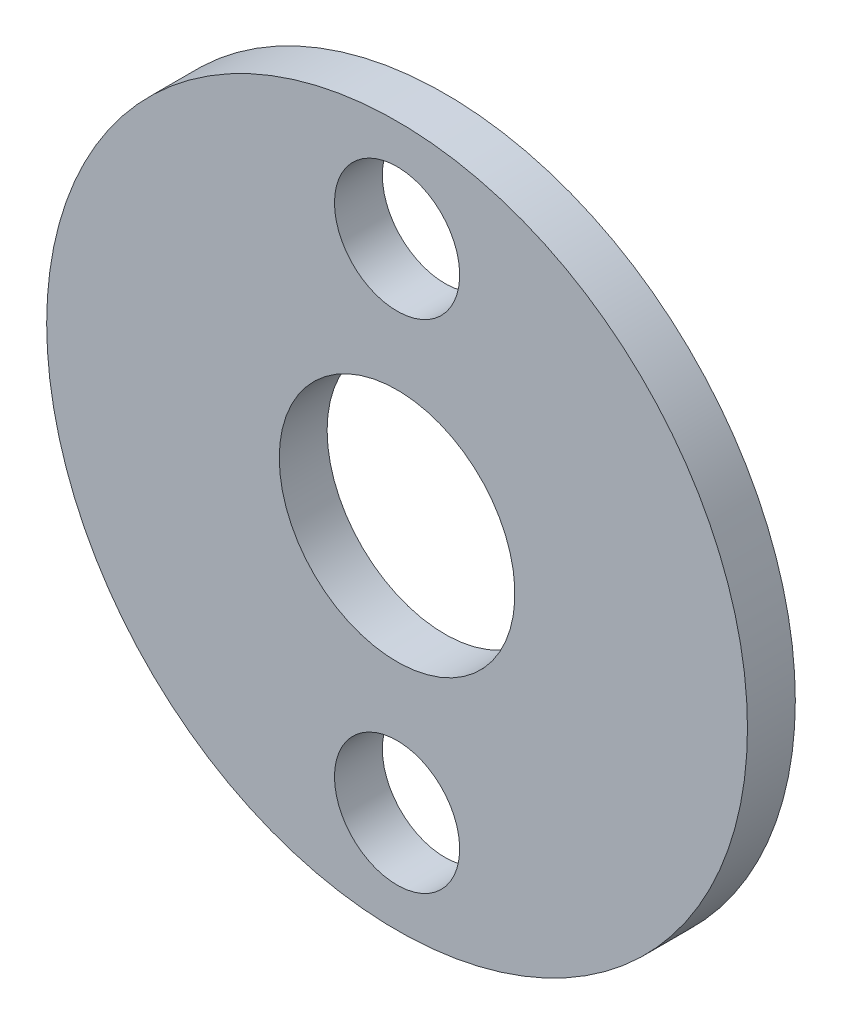
ISO-10303-21;
HEADER;
FILE_DESCRIPTION(('STEP AP214'),'2;1');
FILE_NAME('part.step','',(''),(''),'','','');
FILE_SCHEMA(('AUTOMOTIVE_DESIGN { 1 0 10303 214 1 1 1 1 }'));
ENDSEC;
DATA;
#1=APPLICATION_CONTEXT('core data for automotive mechanical design processes');
#2=APPLICATION_PROTOCOL_DEFINITION('international standard','automotive_design',2000,#1);
#3=PRODUCT_CONTEXT('',#1,'mechanical');
#4=PRODUCT('Part','Part','',(#3));
#5=PRODUCT_RELATED_PRODUCT_CATEGORY('part','',(#4));
#6=PRODUCT_DEFINITION_FORMATION('','',#4);
#7=PRODUCT_DEFINITION_CONTEXT('part definition',#1,'design');
#8=PRODUCT_DEFINITION('design','',#6,#7);
#9=PRODUCT_DEFINITION_SHAPE('','',#8);
#10=(LENGTH_UNIT() NAMED_UNIT(*) SI_UNIT(.MILLI.,.METRE.));
#11=(NAMED_UNIT(*) PLANE_ANGLE_UNIT() SI_UNIT($,.RADIAN.));
#12=(NAMED_UNIT(*) SI_UNIT($,.STERADIAN.) SOLID_ANGLE_UNIT());
#13=UNCERTAINTY_MEASURE_WITH_UNIT(LENGTH_MEASURE(1.E-05),#10,'distance_accuracy_value','');
#14=(GEOMETRIC_REPRESENTATION_CONTEXT(3) GLOBAL_UNCERTAINTY_ASSIGNED_CONTEXT((#13)) GLOBAL_UNIT_ASSIGNED_CONTEXT((#10,
#11,#12)) REPRESENTATION_CONTEXT('',''));
#15=CARTESIAN_POINT('',(0.,0.,0.));
#16=DIRECTION('',(0.,0.,1.));
#17=DIRECTION('',(1.,0.,0.));
#18=AXIS2_PLACEMENT_3D('',#15,#16,#17);
#19=CARTESIAN_POINT('',(0.,0.,1.651));
#20=DIRECTION('',(0.,0.,1.));
#21=DIRECTION('',(1.,0.,0.));
#22=AXIS2_PLACEMENT_3D('',#19,#20,#21);
#23=PLANE('',#22);
#24=CARTESIAN_POINT('',(0.,8.57250000000001,1.651));
#25=DIRECTION('',(0.,0.,1.));
#26=DIRECTION('',(1.,0.,0.));
#27=AXIS2_PLACEMENT_3D('',#24,#25,#26);
#28=CIRCLE('',#27,2.159);
#29=CARTESIAN_POINT('',(-2.159,8.57250000000001,1.651));
#30=VERTEX_POINT('',#29);
#31=EDGE_CURVE('E47',#30,#30,#28,.T.);
#32=ORIENTED_EDGE('',*,*,#31,.F.);
#33=EDGE_LOOP('',(#32));
#34=FACE_BOUND('',#33,.T.);
#35=CARTESIAN_POINT('',(0.,0.,1.651));
#36=DIRECTION('',(0.,0.,1.));
#37=DIRECTION('',(1.,0.,0.));
#38=AXIS2_PLACEMENT_3D('',#35,#36,#37);
#39=CIRCLE('',#38,12.0871729386303);
#40=CARTESIAN_POINT('',(-12.0871729386303,0.,1.651));
#41=VERTEX_POINT('',#40);
#42=EDGE_CURVE('E10',#41,#41,#39,.T.);
#43=ORIENTED_EDGE('',*,*,#42,.T.);
#44=EDGE_LOOP('',(#43));
#45=FACE_BOUND('',#44,.T.);
#46=CARTESIAN_POINT('',(0.,0.,1.651));
#47=DIRECTION('',(0.,0.,1.));
#48=DIRECTION('',(1.,0.,0.));
#49=AXIS2_PLACEMENT_3D('',#46,#47,#48);
#50=CIRCLE('',#49,4.064);
#51=CARTESIAN_POINT('',(-4.064,0.,1.651));
#52=VERTEX_POINT('',#51);
#53=EDGE_CURVE('E42',#52,#52,#50,.T.);
#54=ORIENTED_EDGE('',*,*,#53,.F.);
#55=EDGE_LOOP('',(#54));
#56=FACE_BOUND('',#55,.T.);
#57=CARTESIAN_POINT('',(0.,-8.57250000000001,1.651));
#58=DIRECTION('',(0.,0.,1.));
#59=DIRECTION('',(1.,0.,0.));
#60=AXIS2_PLACEMENT_3D('',#57,#58,#59);
#61=CIRCLE('',#60,2.159);
#62=CARTESIAN_POINT('',(-2.159,-8.57250000000001,1.651));
#63=VERTEX_POINT('',#62);
#64=EDGE_CURVE('E53',#63,#63,#61,.T.);
#65=ORIENTED_EDGE('',*,*,#64,.F.);
#66=EDGE_LOOP('',(#65));
#67=FACE_BOUND('',#66,.T.);
#68=ADVANCED_FACE('F31',(#34,#45,#56,#67),#23,.T.);
#69=CARTESIAN_POINT('',(0.,0.,0.));
#70=DIRECTION('',(0.,0.,1.));
#71=DIRECTION('',(1.,0.,0.));
#72=AXIS2_PLACEMENT_3D('',#69,#70,#71);
#73=PLANE('',#72);
#74=CARTESIAN_POINT('',(0.,0.,0.));
#75=DIRECTION('',(0.,0.,1.));
#76=DIRECTION('',(1.,0.,0.));
#77=AXIS2_PLACEMENT_3D('',#74,#75,#76);
#78=CIRCLE('',#77,12.0871729386303);
#79=CARTESIAN_POINT('',(-12.0871729386303,0.,0.));
#80=VERTEX_POINT('',#79);
#81=EDGE_CURVE('E35',#80,#80,#78,.T.);
#82=ORIENTED_EDGE('',*,*,#81,.F.);
#83=EDGE_LOOP('',(#82));
#84=FACE_BOUND('',#83,.T.);
#85=CARTESIAN_POINT('',(0.,0.,0.));
#86=DIRECTION('',(0.,0.,1.));
#87=DIRECTION('',(1.,0.,0.));
#88=AXIS2_PLACEMENT_3D('',#85,#86,#87);
#89=CIRCLE('',#88,4.064);
#90=CARTESIAN_POINT('',(-4.064,0.,0.));
#91=VERTEX_POINT('',#90);
#92=EDGE_CURVE('E44',#91,#91,#89,.T.);
#93=ORIENTED_EDGE('',*,*,#92,.T.);
#94=EDGE_LOOP('',(#93));
#95=FACE_BOUND('',#94,.T.);
#96=CARTESIAN_POINT('',(0.,8.57250000000001,0.));
#97=DIRECTION('',(0.,0.,1.));
#98=DIRECTION('',(1.,0.,0.));
#99=AXIS2_PLACEMENT_3D('',#96,#97,#98);
#100=CIRCLE('',#99,2.159);
#101=CARTESIAN_POINT('',(-2.159,8.57250000000001,0.));
#102=VERTEX_POINT('',#101);
#103=EDGE_CURVE('E50',#102,#102,#100,.T.);
#104=ORIENTED_EDGE('',*,*,#103,.T.);
#105=EDGE_LOOP('',(#104));
#106=FACE_BOUND('',#105,.T.);
#107=CARTESIAN_POINT('',(0.,-8.57250000000001,0.));
#108=DIRECTION('',(0.,0.,1.));
#109=DIRECTION('',(1.,0.,0.));
#110=AXIS2_PLACEMENT_3D('',#107,#108,#109);
#111=CIRCLE('',#110,2.159);
#112=CARTESIAN_POINT('',(-2.159,-8.57250000000001,0.));
#113=VERTEX_POINT('',#112);
#114=EDGE_CURVE('E56',#113,#113,#111,.T.);
#115=ORIENTED_EDGE('',*,*,#114,.T.);
#116=EDGE_LOOP('',(#115));
#117=FACE_BOUND('',#116,.T.);
#118=ADVANCED_FACE('F66',(#84,#95,#106,#117),#73,.F.);
#119=CARTESIAN_POINT('',(0.,0.,1.651));
#120=DIRECTION('',(0.,0.,-1.));
#121=DIRECTION('',(-1.,0.,0.));
#122=AXIS2_PLACEMENT_3D('',#119,#120,#121);
#123=CYLINDRICAL_SURFACE('',#122,12.0871729386303);
#124=CARTESIAN_POINT('',(-12.0871729386303,0.,1.651));
#125=CARTESIAN_POINT('',(-12.0871729386303,0.,1.63380208333333));
#126=CARTESIAN_POINT('',(-12.0871729386303,0.,1.61660416666667));
#127=CARTESIAN_POINT('',(-12.0871729386303,0.,1.58220833333333));
#128=CARTESIAN_POINT('',(-12.0871729386303,0.,1.56501041666667));
#129=CARTESIAN_POINT('',(-12.0871729386303,0.,1.53061458333333));
#130=CARTESIAN_POINT('',(-12.0871729386303,0.,1.51341666666667));
#131=CARTESIAN_POINT('',(-12.0871729386303,0.,1.47902083333333));
#132=CARTESIAN_POINT('',(-12.0871729386303,0.,1.46182291666667));
#133=CARTESIAN_POINT('',(-12.0871729386303,0.,1.42742708333333));
#134=CARTESIAN_POINT('',(-12.0871729386303,0.,1.41022916666667));
#135=CARTESIAN_POINT('',(-12.0871729386303,0.,1.37583333333333));
#136=CARTESIAN_POINT('',(-12.0871729386303,0.,1.35863541666667));
#137=CARTESIAN_POINT('',(-12.0871729386303,0.,1.32423958333333));
#138=CARTESIAN_POINT('',(-12.0871729386303,0.,1.30704166666667));
#139=CARTESIAN_POINT('',(-12.0871729386303,0.,1.27264583333333));
#140=CARTESIAN_POINT('',(-12.0871729386303,0.,1.25544791666667));
#141=CARTESIAN_POINT('',(-12.0871729386303,0.,1.22105208333333));
#142=CARTESIAN_POINT('',(-12.0871729386303,0.,1.20385416666667));
#143=CARTESIAN_POINT('',(-12.0871729386303,0.,1.16945833333333));
#144=CARTESIAN_POINT('',(-12.0871729386303,0.,1.15226041666667));
#145=CARTESIAN_POINT('',(-12.0871729386303,0.,1.11786458333333));
#146=CARTESIAN_POINT('',(-12.0871729386303,0.,1.10066666666667));
#147=CARTESIAN_POINT('',(-12.0871729386303,0.,1.06627083333333));
#148=CARTESIAN_POINT('',(-12.0871729386303,0.,1.04907291666667));
#149=CARTESIAN_POINT('',(-12.0871729386303,0.,1.01467708333333));
#150=CARTESIAN_POINT('',(-12.0871729386303,0.,0.997479166666666));
#151=CARTESIAN_POINT('',(-12.0871729386303,0.,0.963083333333333));
#152=CARTESIAN_POINT('',(-12.0871729386303,0.,0.945885416666667));
#153=CARTESIAN_POINT('',(-12.0871729386303,0.,0.911489583333333));
#154=CARTESIAN_POINT('',(-12.0871729386303,0.,0.894291666666667));
#155=CARTESIAN_POINT('',(-12.0871729386303,0.,0.859895833333333));
#156=CARTESIAN_POINT('',(-12.0871729386303,0.,0.842697916666667));
#157=CARTESIAN_POINT('',(-12.0871729386303,0.,0.808302083333333));
#158=CARTESIAN_POINT('',(-12.0871729386303,0.,0.791104166666667));
#159=CARTESIAN_POINT('',(-12.0871729386303,0.,0.756708333333333));
#160=CARTESIAN_POINT('',(-12.0871729386303,0.,0.739510416666667));
#161=CARTESIAN_POINT('',(-12.0871729386303,0.,0.705114583333333));
#162=CARTESIAN_POINT('',(-12.0871729386303,0.,0.687916666666667));
#163=CARTESIAN_POINT('',(-12.0871729386303,0.,0.653520833333333));
#164=CARTESIAN_POINT('',(-12.0871729386303,0.,0.636322916666667));
#165=CARTESIAN_POINT('',(-12.0871729386303,0.,0.601927083333333));
#166=CARTESIAN_POINT('',(-12.0871729386303,0.,0.584729166666667));
#167=CARTESIAN_POINT('',(-12.0871729386303,0.,0.550333333333333));
#168=CARTESIAN_POINT('',(-12.0871729386303,0.,0.533135416666667));
#169=CARTESIAN_POINT('',(-12.0871729386303,0.,0.498739583333333));
#170=CARTESIAN_POINT('',(-12.0871729386303,0.,0.481541666666667));
#171=CARTESIAN_POINT('',(-12.0871729386303,0.,0.447145833333333));
#172=CARTESIAN_POINT('',(-12.0871729386303,0.,0.429947916666667));
#173=CARTESIAN_POINT('',(-12.0871729386303,0.,0.395552083333333));
#174=CARTESIAN_POINT('',(-12.0871729386303,0.,0.378354166666667));
#175=CARTESIAN_POINT('',(-12.0871729386303,0.,0.343958333333333));
#176=CARTESIAN_POINT('',(-12.0871729386303,0.,0.326760416666667));
#177=CARTESIAN_POINT('',(-12.0871729386303,0.,0.292364583333333));
#178=CARTESIAN_POINT('',(-12.0871729386303,0.,0.275166666666667));
#179=CARTESIAN_POINT('',(-12.0871729386303,0.,0.240770833333333));
#180=CARTESIAN_POINT('',(-12.0871729386303,0.,0.223572916666667));
#181=CARTESIAN_POINT('',(-12.0871729386303,0.,0.189177083333333));
#182=CARTESIAN_POINT('',(-12.0871729386303,0.,0.171979166666667));
#183=CARTESIAN_POINT('',(-12.0871729386303,0.,0.137583333333333));
#184=CARTESIAN_POINT('',(-12.0871729386303,0.,0.120385416666667));
#185=CARTESIAN_POINT('',(-12.0871729386303,0.,0.0859895833333333));
#186=CARTESIAN_POINT('',(-12.0871729386303,0.,0.0687916666666667));
#187=CARTESIAN_POINT('',(-12.0871729386303,0.,0.0343958333333333));
#188=CARTESIAN_POINT('',(-12.0871729386303,0.,0.0171979166666666));
#189=CARTESIAN_POINT('',(-12.0871729386303,0.,0.));
#190=B_SPLINE_CURVE_WITH_KNOTS('',3,(#124,#125,#126,#127,#128,#129,#130,#131,#132,#133,#134,
#135,#136,#137,#138,#139,#140,#141,#142,#143,#144,#145,#146,#147,#148,#149,#150,#151,#152,#153,
#154,#155,#156,#157,#158,#159,#160,#161,#162,#163,#164,#165,#166,#167,#168,#169,#170,#171,#172,
#173,#174,#175,#176,#177,#178,#179,#180,#181,#182,#183,#184,#185,#186,#187,#188,#189),
.UNSPECIFIED.,.F.,.F.,(4,2,2,2,2,2,2,2,2,2,2,2,2,2,2,2,2,2,2,2,2,2,2,2,2,2,2,2,2,2,2,2,4),(0.,
0.05159375,0.1031875,0.15478125,0.206375,0.25796875,0.3095625,0.36115625,0.41275,0.46434375,
0.5159375,0.56753125,0.619125,0.67071875,0.7223125,0.77390625,0.8255,0.87709375,0.9286875,
0.98028125,1.031875,1.08346875,1.1350625,1.18665625,1.23825,1.28984375,1.3414375,1.39303125,
1.444625,1.49621875,1.5478125,1.59940625,1.651),.UNSPECIFIED.);
#191=EDGE_CURVE('BSEAM33',#41,#80,#190,.T.);
#192=ORIENTED_EDGE('',*,*,#42,.F.);
#193=ORIENTED_EDGE('',*,*,#81,.T.);
#194=ORIENTED_EDGE('',*,*,#191,.T.);
#195=ORIENTED_EDGE('',*,*,#191,.F.);
#196=EDGE_LOOP('',(#192,#194,#193,#195));
#197=FACE_BOUND('',#196,.T.);
#198=ADVANCED_FACE('F33',(#197),#123,.T.);
#199=CARTESIAN_POINT('',(0.,0.,1.651));
#200=DIRECTION('',(0.,0.,-1.));
#201=DIRECTION('',(-1.,0.,0.));
#202=AXIS2_PLACEMENT_3D('',#199,#200,#201);
#203=CYLINDRICAL_SURFACE('',#202,4.064);
#204=CARTESIAN_POINT('',(-4.064,0.,1.651));
#205=CARTESIAN_POINT('',(-4.064,0.,1.63380208333333));
#206=CARTESIAN_POINT('',(-4.064,0.,1.61660416666667));
#207=CARTESIAN_POINT('',(-4.064,0.,1.58220833333333));
#208=CARTESIAN_POINT('',(-4.064,0.,1.56501041666667));
#209=CARTESIAN_POINT('',(-4.064,0.,1.53061458333333));
#210=CARTESIAN_POINT('',(-4.064,0.,1.51341666666667));
#211=CARTESIAN_POINT('',(-4.064,0.,1.47902083333333));
#212=CARTESIAN_POINT('',(-4.064,0.,1.46182291666667));
#213=CARTESIAN_POINT('',(-4.064,0.,1.42742708333333));
#214=CARTESIAN_POINT('',(-4.064,0.,1.41022916666667));
#215=CARTESIAN_POINT('',(-4.064,0.,1.37583333333333));
#216=CARTESIAN_POINT('',(-4.064,0.,1.35863541666667));
#217=CARTESIAN_POINT('',(-4.064,0.,1.32423958333333));
#218=CARTESIAN_POINT('',(-4.064,0.,1.30704166666667));
#219=CARTESIAN_POINT('',(-4.064,0.,1.27264583333333));
#220=CARTESIAN_POINT('',(-4.064,0.,1.25544791666667));
#221=CARTESIAN_POINT('',(-4.064,0.,1.22105208333333));
#222=CARTESIAN_POINT('',(-4.064,0.,1.20385416666667));
#223=CARTESIAN_POINT('',(-4.064,0.,1.16945833333333));
#224=CARTESIAN_POINT('',(-4.064,0.,1.15226041666667));
#225=CARTESIAN_POINT('',(-4.064,0.,1.11786458333333));
#226=CARTESIAN_POINT('',(-4.064,0.,1.10066666666667));
#227=CARTESIAN_POINT('',(-4.064,0.,1.06627083333333));
#228=CARTESIAN_POINT('',(-4.064,0.,1.04907291666667));
#229=CARTESIAN_POINT('',(-4.064,0.,1.01467708333333));
#230=CARTESIAN_POINT('',(-4.064,0.,0.997479166666666));
#231=CARTESIAN_POINT('',(-4.064,0.,0.963083333333333));
#232=CARTESIAN_POINT('',(-4.064,0.,0.945885416666666));
#233=CARTESIAN_POINT('',(-4.064,0.,0.911489583333333));
#234=CARTESIAN_POINT('',(-4.064,0.,0.894291666666666));
#235=CARTESIAN_POINT('',(-4.064,0.,0.859895833333333));
#236=CARTESIAN_POINT('',(-4.064,0.,0.842697916666666));
#237=CARTESIAN_POINT('',(-4.064,0.,0.808302083333333));
#238=CARTESIAN_POINT('',(-4.064,0.,0.791104166666666));
#239=CARTESIAN_POINT('',(-4.064,0.,0.756708333333333));
#240=CARTESIAN_POINT('',(-4.064,0.,0.739510416666667));
#241=CARTESIAN_POINT('',(-4.064,0.,0.705114583333333));
#242=CARTESIAN_POINT('',(-4.064,0.,0.687916666666667));
#243=CARTESIAN_POINT('',(-4.064,0.,0.653520833333333));
#244=CARTESIAN_POINT('',(-4.064,0.,0.636322916666667));
#245=CARTESIAN_POINT('',(-4.064,0.,0.601927083333333));
#246=CARTESIAN_POINT('',(-4.064,0.,0.584729166666667));
#247=CARTESIAN_POINT('',(-4.064,0.,0.550333333333333));
#248=CARTESIAN_POINT('',(-4.064,0.,0.533135416666667));
#249=CARTESIAN_POINT('',(-4.064,0.,0.498739583333333));
#250=CARTESIAN_POINT('',(-4.064,0.,0.481541666666667));
#251=CARTESIAN_POINT('',(-4.064,0.,0.447145833333333));
#252=CARTESIAN_POINT('',(-4.064,0.,0.429947916666667));
#253=CARTESIAN_POINT('',(-4.064,0.,0.395552083333333));
#254=CARTESIAN_POINT('',(-4.064,0.,0.378354166666667));
#255=CARTESIAN_POINT('',(-4.064,0.,0.343958333333333));
#256=CARTESIAN_POINT('',(-4.064,0.,0.326760416666667));
#257=CARTESIAN_POINT('',(-4.064,0.,0.292364583333333));
#258=CARTESIAN_POINT('',(-4.064,0.,0.275166666666667));
#259=CARTESIAN_POINT('',(-4.064,0.,0.240770833333333));
#260=CARTESIAN_POINT('',(-4.064,0.,0.223572916666667));
#261=CARTESIAN_POINT('',(-4.064,0.,0.189177083333333));
#262=CARTESIAN_POINT('',(-4.064,0.,0.171979166666667));
#263=CARTESIAN_POINT('',(-4.064,0.,0.137583333333333));
#264=CARTESIAN_POINT('',(-4.064,0.,0.120385416666667));
#265=CARTESIAN_POINT('',(-4.064,0.,0.0859895833333333));
#266=CARTESIAN_POINT('',(-4.064,0.,0.0687916666666667));
#267=CARTESIAN_POINT('',(-4.064,0.,0.0343958333333333));
#268=CARTESIAN_POINT('',(-4.064,0.,0.0171979166666666));
#269=CARTESIAN_POINT('',(-4.064,0.,0.));
#270=B_SPLINE_CURVE_WITH_KNOTS('',3,(#204,#205,#206,#207,#208,#209,#210,#211,#212,#213,#214,
#215,#216,#217,#218,#219,#220,#221,#222,#223,#224,#225,#226,#227,#228,#229,#230,#231,#232,#233,
#234,#235,#236,#237,#238,#239,#240,#241,#242,#243,#244,#245,#246,#247,#248,#249,#250,#251,#252,
#253,#254,#255,#256,#257,#258,#259,#260,#261,#262,#263,#264,#265,#266,#267,#268,#269),
.UNSPECIFIED.,.F.,.F.,(4,2,2,2,2,2,2,2,2,2,2,2,2,2,2,2,2,2,2,2,2,2,2,2,2,2,2,2,2,2,2,2,4),(0.,
0.0515937500000002,0.1031875,0.15478125,0.206375,0.25796875,0.3095625,0.36115625,0.41275,
0.46434375,0.5159375,0.56753125,0.619125,0.67071875,0.7223125,0.77390625,0.8255,0.87709375,
0.9286875,0.98028125,1.031875,1.08346875,1.1350625,1.18665625,1.23825,1.28984375,1.3414375,
1.39303125,1.444625,1.49621875,1.5478125,1.59940625,1.651),.UNSPECIFIED.);
#271=EDGE_CURVE('BSEAM75',#52,#91,#270,.T.);
#272=ORIENTED_EDGE('',*,*,#53,.T.);
#273=ORIENTED_EDGE('',*,*,#92,.F.);
#274=ORIENTED_EDGE('',*,*,#271,.T.);
#275=ORIENTED_EDGE('',*,*,#271,.F.);
#276=EDGE_LOOP('',(#272,#274,#273,#275));
#277=FACE_BOUND('',#276,.T.);
#278=ADVANCED_FACE('F75',(#277),#203,.F.);
#279=CARTESIAN_POINT('',(0.,8.57250000000001,1.651));
#280=DIRECTION('',(0.,0.,-1.));
#281=DIRECTION('',(-1.,0.,0.));
#282=AXIS2_PLACEMENT_3D('',#279,#280,#281);
#283=CYLINDRICAL_SURFACE('',#282,2.159);
#284=CARTESIAN_POINT('',(-2.159,8.57250000000001,1.651));
#285=CARTESIAN_POINT('',(-2.159,8.57250000000001,1.63380208333333));
#286=CARTESIAN_POINT('',(-2.159,8.57250000000001,1.61660416666667));
#287=CARTESIAN_POINT('',(-2.159,8.57250000000001,1.58220833333333));
#288=CARTESIAN_POINT('',(-2.159,8.57250000000001,1.56501041666667));
#289=CARTESIAN_POINT('',(-2.159,8.57250000000001,1.53061458333333));
#290=CARTESIAN_POINT('',(-2.159,8.57250000000001,1.51341666666667));
#291=CARTESIAN_POINT('',(-2.159,8.57250000000001,1.47902083333333));
#292=CARTESIAN_POINT('',(-2.159,8.57250000000001,1.46182291666667));
#293=CARTESIAN_POINT('',(-2.159,8.57250000000001,1.42742708333333));
#294=CARTESIAN_POINT('',(-2.159,8.57250000000001,1.41022916666667));
#295=CARTESIAN_POINT('',(-2.159,8.57250000000001,1.37583333333333));
#296=CARTESIAN_POINT('',(-2.159,8.57250000000001,1.35863541666667));
#297=CARTESIAN_POINT('',(-2.159,8.57250000000001,1.32423958333333));
#298=CARTESIAN_POINT('',(-2.159,8.57250000000001,1.30704166666667));
#299=CARTESIAN_POINT('',(-2.159,8.57250000000001,1.27264583333333));
#300=CARTESIAN_POINT('',(-2.159,8.57250000000001,1.25544791666667));
#301=CARTESIAN_POINT('',(-2.159,8.57250000000001,1.22105208333333));
#302=CARTESIAN_POINT('',(-2.159,8.57250000000001,1.20385416666667));
#303=CARTESIAN_POINT('',(-2.159,8.57250000000001,1.16945833333333));
#304=CARTESIAN_POINT('',(-2.159,8.57250000000001,1.15226041666667));
#305=CARTESIAN_POINT('',(-2.159,8.57250000000001,1.11786458333333));
#306=CARTESIAN_POINT('',(-2.159,8.57250000000001,1.10066666666667));
#307=CARTESIAN_POINT('',(-2.159,8.57250000000001,1.06627083333333));
#308=CARTESIAN_POINT('',(-2.159,8.57250000000001,1.04907291666667));
#309=CARTESIAN_POINT('',(-2.159,8.57250000000001,1.01467708333333));
#310=CARTESIAN_POINT('',(-2.159,8.57250000000001,0.997479166666666));
#311=CARTESIAN_POINT('',(-2.159,8.57250000000001,0.963083333333333));
#312=CARTESIAN_POINT('',(-2.159,8.57250000000001,0.945885416666666));
#313=CARTESIAN_POINT('',(-2.159,8.57250000000001,0.911489583333333));
#314=CARTESIAN_POINT('',(-2.159,8.57250000000001,0.894291666666666));
#315=CARTESIAN_POINT('',(-2.159,8.57250000000001,0.859895833333333));
#316=CARTESIAN_POINT('',(-2.159,8.57250000000001,0.842697916666666));
#317=CARTESIAN_POINT('',(-2.159,8.57250000000001,0.808302083333333));
#318=CARTESIAN_POINT('',(-2.159,8.57250000000001,0.791104166666666));
#319=CARTESIAN_POINT('',(-2.159,8.57250000000001,0.756708333333333));
#320=CARTESIAN_POINT('',(-2.159,8.57250000000001,0.739510416666667));
#321=CARTESIAN_POINT('',(-2.159,8.57250000000001,0.705114583333333));
#322=CARTESIAN_POINT('',(-2.159,8.57250000000001,0.687916666666667));
#323=CARTESIAN_POINT('',(-2.159,8.57250000000001,0.653520833333333));
#324=CARTESIAN_POINT('',(-2.159,8.57250000000001,0.636322916666667));
#325=CARTESIAN_POINT('',(-2.159,8.57250000000001,0.601927083333333));
#326=CARTESIAN_POINT('',(-2.159,8.57250000000001,0.584729166666667));
#327=CARTESIAN_POINT('',(-2.159,8.57250000000001,0.550333333333333));
#328=CARTESIAN_POINT('',(-2.159,8.57250000000001,0.533135416666667));
#329=CARTESIAN_POINT('',(-2.159,8.57250000000001,0.498739583333333));
#330=CARTESIAN_POINT('',(-2.159,8.57250000000001,0.481541666666667));
#331=CARTESIAN_POINT('',(-2.159,8.57250000000001,0.447145833333333));
#332=CARTESIAN_POINT('',(-2.159,8.57250000000001,0.429947916666667));
#333=CARTESIAN_POINT('',(-2.159,8.57250000000001,0.395552083333333));
#334=CARTESIAN_POINT('',(-2.159,8.57250000000001,0.378354166666667));
#335=CARTESIAN_POINT('',(-2.159,8.57250000000001,0.343958333333333));
#336=CARTESIAN_POINT('',(-2.159,8.57250000000001,0.326760416666667));
#337=CARTESIAN_POINT('',(-2.159,8.57250000000001,0.292364583333333));
#338=CARTESIAN_POINT('',(-2.159,8.57250000000001,0.275166666666667));
#339=CARTESIAN_POINT('',(-2.159,8.57250000000001,0.240770833333333));
#340=CARTESIAN_POINT('',(-2.159,8.57250000000001,0.223572916666667));
#341=CARTESIAN_POINT('',(-2.159,8.57250000000001,0.189177083333333));
#342=CARTESIAN_POINT('',(-2.159,8.57250000000001,0.171979166666667));
#343=CARTESIAN_POINT('',(-2.159,8.57250000000001,0.137583333333333));
#344=CARTESIAN_POINT('',(-2.159,8.57250000000001,0.120385416666667));
#345=CARTESIAN_POINT('',(-2.159,8.57250000000001,0.0859895833333333));
#346=CARTESIAN_POINT('',(-2.159,8.57250000000001,0.0687916666666667));
#347=CARTESIAN_POINT('',(-2.159,8.57250000000001,0.0343958333333333));
#348=CARTESIAN_POINT('',(-2.159,8.57250000000001,0.0171979166666666));
#349=CARTESIAN_POINT('',(-2.159,8.57250000000001,0.));
#350=B_SPLINE_CURVE_WITH_KNOTS('',3,(#284,#285,#286,#287,#288,#289,#290,#291,#292,#293,#294,
#295,#296,#297,#298,#299,#300,#301,#302,#303,#304,#305,#306,#307,#308,#309,#310,#311,#312,#313,
#314,#315,#316,#317,#318,#319,#320,#321,#322,#323,#324,#325,#326,#327,#328,#329,#330,#331,#332,
#333,#334,#335,#336,#337,#338,#339,#340,#341,#342,#343,#344,#345,#346,#347,#348,#349),
.UNSPECIFIED.,.F.,.F.,(4,2,2,2,2,2,2,2,2,2,2,2,2,2,2,2,2,2,2,2,2,2,2,2,2,2,2,2,2,2,2,2,4),(0.,
0.0515937500000002,0.1031875,0.15478125,0.206375,0.25796875,0.3095625,0.36115625,0.41275,
0.46434375,0.5159375,0.56753125,0.619125,0.67071875,0.7223125,0.77390625,0.8255,0.87709375,
0.9286875,0.98028125,1.031875,1.08346875,1.1350625,1.18665625,1.23825,1.28984375,1.3414375,
1.39303125,1.444625,1.49621875,1.5478125,1.59940625,1.651),.UNSPECIFIED.);
#351=EDGE_CURVE('BSEAM78',#30,#102,#350,.T.);
#352=ORIENTED_EDGE('',*,*,#31,.T.);
#353=ORIENTED_EDGE('',*,*,#103,.F.);
#354=ORIENTED_EDGE('',*,*,#351,.T.);
#355=ORIENTED_EDGE('',*,*,#351,.F.);
#356=EDGE_LOOP('',(#352,#354,#353,#355));
#357=FACE_BOUND('',#356,.T.);
#358=ADVANCED_FACE('F78',(#357),#283,.F.);
#359=CARTESIAN_POINT('',(0.,-8.57250000000001,1.651));
#360=DIRECTION('',(0.,0.,-1.));
#361=DIRECTION('',(-1.,0.,0.));
#362=AXIS2_PLACEMENT_3D('',#359,#360,#361);
#363=CYLINDRICAL_SURFACE('',#362,2.159);
#364=CARTESIAN_POINT('',(-2.159,-8.57250000000001,1.651));
#365=CARTESIAN_POINT('',(-2.159,-8.57250000000001,1.63380208333333));
#366=CARTESIAN_POINT('',(-2.159,-8.57250000000001,1.61660416666667));
#367=CARTESIAN_POINT('',(-2.159,-8.57250000000001,1.58220833333333));
#368=CARTESIAN_POINT('',(-2.159,-8.57250000000001,1.56501041666667));
#369=CARTESIAN_POINT('',(-2.159,-8.57250000000001,1.53061458333333));
#370=CARTESIAN_POINT('',(-2.159,-8.57250000000001,1.51341666666667));
#371=CARTESIAN_POINT('',(-2.159,-8.57250000000001,1.47902083333333));
#372=CARTESIAN_POINT('',(-2.159,-8.57250000000001,1.46182291666667));
#373=CARTESIAN_POINT('',(-2.159,-8.57250000000001,1.42742708333333));
#374=CARTESIAN_POINT('',(-2.159,-8.57250000000001,1.41022916666667));
#375=CARTESIAN_POINT('',(-2.159,-8.57250000000001,1.37583333333333));
#376=CARTESIAN_POINT('',(-2.159,-8.57250000000001,1.35863541666667));
#377=CARTESIAN_POINT('',(-2.159,-8.57250000000001,1.32423958333333));
#378=CARTESIAN_POINT('',(-2.159,-8.57250000000001,1.30704166666667));
#379=CARTESIAN_POINT('',(-2.159,-8.57250000000001,1.27264583333333));
#380=CARTESIAN_POINT('',(-2.159,-8.57250000000001,1.25544791666667));
#381=CARTESIAN_POINT('',(-2.159,-8.57250000000001,1.22105208333333));
#382=CARTESIAN_POINT('',(-2.159,-8.57250000000001,1.20385416666667));
#383=CARTESIAN_POINT('',(-2.159,-8.57250000000001,1.16945833333333));
#384=CARTESIAN_POINT('',(-2.159,-8.57250000000001,1.15226041666667));
#385=CARTESIAN_POINT('',(-2.159,-8.57250000000001,1.11786458333333));
#386=CARTESIAN_POINT('',(-2.159,-8.57250000000001,1.10066666666667));
#387=CARTESIAN_POINT('',(-2.159,-8.57250000000001,1.06627083333333));
#388=CARTESIAN_POINT('',(-2.159,-8.57250000000001,1.04907291666667));
#389=CARTESIAN_POINT('',(-2.159,-8.57250000000001,1.01467708333333));
#390=CARTESIAN_POINT('',(-2.159,-8.57250000000001,0.997479166666666));
#391=CARTESIAN_POINT('',(-2.159,-8.57250000000001,0.963083333333333));
#392=CARTESIAN_POINT('',(-2.159,-8.57250000000001,0.945885416666666));
#393=CARTESIAN_POINT('',(-2.159,-8.57250000000001,0.911489583333333));
#394=CARTESIAN_POINT('',(-2.159,-8.57250000000001,0.894291666666666));
#395=CARTESIAN_POINT('',(-2.159,-8.57250000000001,0.859895833333333));
#396=CARTESIAN_POINT('',(-2.159,-8.57250000000001,0.842697916666666));
#397=CARTESIAN_POINT('',(-2.159,-8.57250000000001,0.808302083333333));
#398=CARTESIAN_POINT('',(-2.159,-8.57250000000001,0.791104166666666));
#399=CARTESIAN_POINT('',(-2.159,-8.57250000000001,0.756708333333333));
#400=CARTESIAN_POINT('',(-2.159,-8.57250000000001,0.739510416666667));
#401=CARTESIAN_POINT('',(-2.159,-8.57250000000001,0.705114583333333));
#402=CARTESIAN_POINT('',(-2.159,-8.57250000000001,0.687916666666667));
#403=CARTESIAN_POINT('',(-2.159,-8.57250000000001,0.653520833333333));
#404=CARTESIAN_POINT('',(-2.159,-8.57250000000001,0.636322916666667));
#405=CARTESIAN_POINT('',(-2.159,-8.57250000000001,0.601927083333333));
#406=CARTESIAN_POINT('',(-2.159,-8.57250000000001,0.584729166666667));
#407=CARTESIAN_POINT('',(-2.159,-8.57250000000001,0.550333333333333));
#408=CARTESIAN_POINT('',(-2.159,-8.57250000000001,0.533135416666667));
#409=CARTESIAN_POINT('',(-2.159,-8.57250000000001,0.498739583333333));
#410=CARTESIAN_POINT('',(-2.159,-8.57250000000001,0.481541666666667));
#411=CARTESIAN_POINT('',(-2.159,-8.57250000000001,0.447145833333333));
#412=CARTESIAN_POINT('',(-2.159,-8.57250000000001,0.429947916666667));
#413=CARTESIAN_POINT('',(-2.159,-8.57250000000001,0.395552083333333));
#414=CARTESIAN_POINT('',(-2.159,-8.57250000000001,0.378354166666667));
#415=CARTESIAN_POINT('',(-2.159,-8.57250000000001,0.343958333333333));
#416=CARTESIAN_POINT('',(-2.159,-8.57250000000001,0.326760416666667));
#417=CARTESIAN_POINT('',(-2.159,-8.57250000000001,0.292364583333333));
#418=CARTESIAN_POINT('',(-2.159,-8.57250000000001,0.275166666666667));
#419=CARTESIAN_POINT('',(-2.159,-8.57250000000001,0.240770833333333));
#420=CARTESIAN_POINT('',(-2.159,-8.57250000000001,0.223572916666667));
#421=CARTESIAN_POINT('',(-2.159,-8.57250000000001,0.189177083333333));
#422=CARTESIAN_POINT('',(-2.159,-8.57250000000001,0.171979166666667));
#423=CARTESIAN_POINT('',(-2.159,-8.57250000000001,0.137583333333333));
#424=CARTESIAN_POINT('',(-2.159,-8.57250000000001,0.120385416666667));
#425=CARTESIAN_POINT('',(-2.159,-8.57250000000001,0.0859895833333333));
#426=CARTESIAN_POINT('',(-2.159,-8.57250000000001,0.0687916666666667));
#427=CARTESIAN_POINT('',(-2.159,-8.57250000000001,0.0343958333333333));
#428=CARTESIAN_POINT('',(-2.159,-8.57250000000001,0.0171979166666666));
#429=CARTESIAN_POINT('',(-2.159,-8.57250000000001,0.));
#430=B_SPLINE_CURVE_WITH_KNOTS('',3,(#364,#365,#366,#367,#368,#369,#370,#371,#372,#373,#374,
#375,#376,#377,#378,#379,#380,#381,#382,#383,#384,#385,#386,#387,#388,#389,#390,#391,#392,#393,
#394,#395,#396,#397,#398,#399,#400,#401,#402,#403,#404,#405,#406,#407,#408,#409,#410,#411,#412,
#413,#414,#415,#416,#417,#418,#419,#420,#421,#422,#423,#424,#425,#426,#427,#428,#429),
.UNSPECIFIED.,.F.,.F.,(4,2,2,2,2,2,2,2,2,2,2,2,2,2,2,2,2,2,2,2,2,2,2,2,2,2,2,2,2,2,2,2,4),(0.,
0.0515937500000002,0.1031875,0.15478125,0.206375,0.25796875,0.3095625,0.36115625,0.41275,
0.46434375,0.5159375,0.56753125,0.619125,0.67071875,0.7223125,0.77390625,0.8255,0.87709375,
0.9286875,0.98028125,1.031875,1.08346875,1.1350625,1.18665625,1.23825,1.28984375,1.3414375,
1.39303125,1.444625,1.49621875,1.5478125,1.59940625,1.651),.UNSPECIFIED.);
#431=EDGE_CURVE('BSEAM62',#63,#113,#430,.T.);
#432=ORIENTED_EDGE('',*,*,#64,.T.);
#433=ORIENTED_EDGE('',*,*,#114,.F.);
#434=ORIENTED_EDGE('',*,*,#431,.T.);
#435=ORIENTED_EDGE('',*,*,#431,.F.);
#436=EDGE_LOOP('',(#432,#434,#433,#435));
#437=FACE_BOUND('',#436,.T.);
#438=ADVANCED_FACE('F62',(#437),#363,.F.);
#439=CLOSED_SHELL('',(#68,#118,#198,#278,#358,#438));
#440=MANIFOLD_SOLID_BREP('B2',#439);
#441=ADVANCED_BREP_SHAPE_REPRESENTATION('',(#18,#440),#14);
#442=SHAPE_DEFINITION_REPRESENTATION(#9,#441);
ENDSEC;
END-ISO-10303-21;
